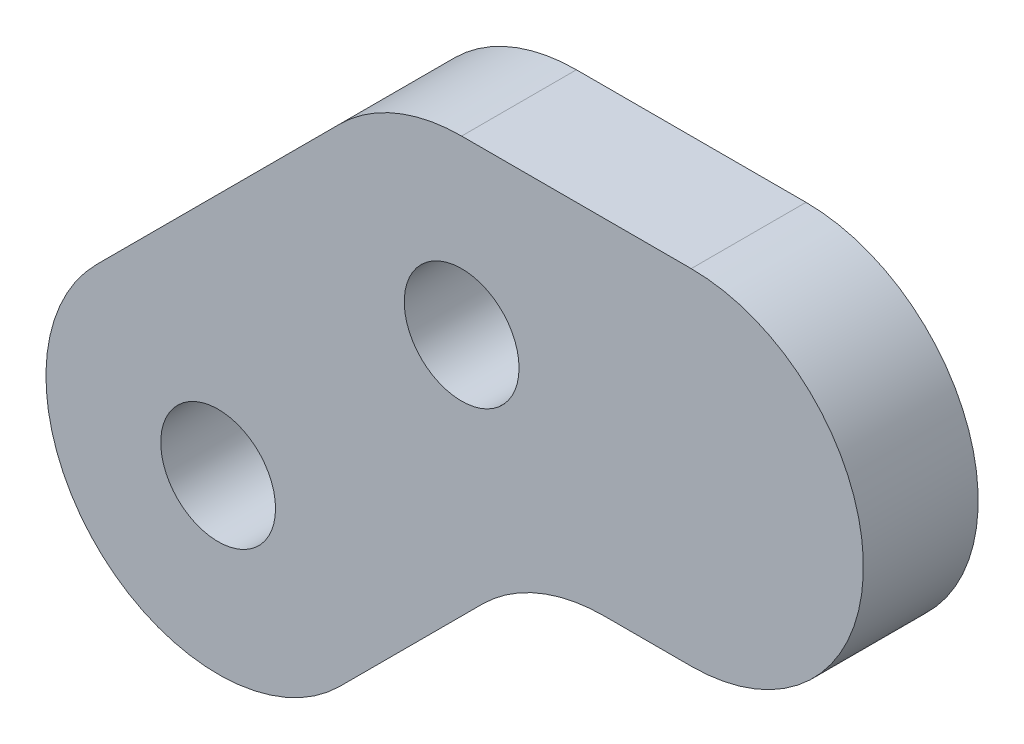
ISO-10303-21;
HEADER;
FILE_DESCRIPTION(('STEP AP214'),'2;1');
FILE_NAME('part.step','',(''),(''),'','','');
FILE_SCHEMA(('AUTOMOTIVE_DESIGN { 1 0 10303 214 1 1 1 1 }'));
ENDSEC;
DATA;
#1=APPLICATION_CONTEXT('core data for automotive mechanical design processes');
#2=APPLICATION_PROTOCOL_DEFINITION('international standard','automotive_design',2000,#1);
#3=PRODUCT_CONTEXT('',#1,'mechanical');
#4=PRODUCT('Part','Part','',(#3));
#5=PRODUCT_RELATED_PRODUCT_CATEGORY('part','',(#4));
#6=PRODUCT_DEFINITION_FORMATION('','',#4);
#7=PRODUCT_DEFINITION_CONTEXT('part definition',#1,'design');
#8=PRODUCT_DEFINITION('design','',#6,#7);
#9=PRODUCT_DEFINITION_SHAPE('','',#8);
#10=(LENGTH_UNIT() NAMED_UNIT(*) SI_UNIT(.MILLI.,.METRE.));
#11=(NAMED_UNIT(*) PLANE_ANGLE_UNIT() SI_UNIT($,.RADIAN.));
#12=(NAMED_UNIT(*) SI_UNIT($,.STERADIAN.) SOLID_ANGLE_UNIT());
#13=UNCERTAINTY_MEASURE_WITH_UNIT(LENGTH_MEASURE(1.E-05),#10,'distance_accuracy_value','');
#14=(GEOMETRIC_REPRESENTATION_CONTEXT(3) GLOBAL_UNCERTAINTY_ASSIGNED_CONTEXT((#13)) GLOBAL_UNIT_ASSIGNED_CONTEXT((#10,
#11,#12)) REPRESENTATION_CONTEXT('',''));
#15=CARTESIAN_POINT('',(0.,0.,0.));
#16=DIRECTION('',(0.,0.,1.));
#17=DIRECTION('',(1.,0.,0.));
#18=AXIS2_PLACEMENT_3D('',#15,#16,#17);
#19=CARTESIAN_POINT('',(139.5991218753,252.9956717112,3.));
#20=DIRECTION('',(0.,0.,1.));
#21=DIRECTION('',(1.,0.,0.));
#22=AXIS2_PLACEMENT_3D('',#19,#20,#21);
#23=PLANE('',#22);
#24=CARTESIAN_POINT('',(133.599121875279,252.9956717112,3.));
#25=DIRECTION('',(0.,0.,1.));
#26=DIRECTION('',(1.,0.,0.));
#27=AXIS2_PLACEMENT_3D('',#24,#25,#26);
#28=CIRCLE('',#27,1.50000000002112);
#29=CARTESIAN_POINT('',(135.0991218753,252.9956717112,3.));
#30=VERTEX_POINT('',#29);
#31=EDGE_CURVE('E135',#30,#30,#28,.T.);
#32=ORIENTED_EDGE('',*,*,#31,.F.);
#33=EDGE_LOOP('',(#32));
#34=FACE_BOUND('',#33,.T.);
#35=CARTESIAN_POINT('',(139.5991218753,252.9956717112,3.));
#36=DIRECTION('',(0.,0.,1.));
#37=DIRECTION('',(1.,0.,0.));
#38=AXIS2_PLACEMENT_3D('',#35,#36,#37);
#39=CIRCLE('',#38,4.49999999999998);
#40=CARTESIAN_POINT('',(139.5991218753,248.4956717112,3.));
#41=VERTEX_POINT('',#40);
#42=CARTESIAN_POINT('',(139.5991218753,257.4956717112,3.));
#43=VERTEX_POINT('',#42);
#44=EDGE_CURVE('E147',#41,#43,#39,.T.);
#45=ORIENTED_EDGE('',*,*,#44,.T.);
#46=DIRECTION('',(-1.,0.,0.));
#47=VECTOR('',#46,1.);
#48=CARTESIAN_POINT('',(139.5991218753,257.4956717112,3.));
#49=LINE('',#48,#47);
#50=CARTESIAN_POINT('',(133.5991218753,257.4956717112,3.));
#51=VERTEX_POINT('',#50);
#52=EDGE_CURVE('E91',#43,#51,#49,.T.);
#53=ORIENTED_EDGE('',*,*,#52,.T.);
#54=CARTESIAN_POINT('',(133.599121875279,252.9956717112,3.));
#55=DIRECTION('',(0.,0.,1.));
#56=DIRECTION('',(1.,0.,0.));
#57=AXIS2_PLACEMENT_3D('',#54,#55,#56);
#58=CIRCLE('',#57,4.5);
#59=CARTESIAN_POINT('',(130.4171413599,256.1776522265,3.));
#60=VERTEX_POINT('',#59);
#61=EDGE_CURVE('E162',#51,#60,#58,.T.);
#62=ORIENTED_EDGE('',*,*,#61,.T.);
#63=DIRECTION('',(-0.707106781186548,-0.707106781186547,0.));
#64=VECTOR('',#63,1.);
#65=CARTESIAN_POINT('',(124.0531803292,249.8136911958,3.));
#66=LINE('',#65,#64);
#67=CARTESIAN_POINT('',(124.0531803292,249.8136911958,3.));
#68=VERTEX_POINT('',#67);
#69=EDGE_CURVE('E173',#60,#68,#66,.T.);
#70=ORIENTED_EDGE('',*,*,#69,.T.);
#71=CARTESIAN_POINT('',(127.23516084455,246.6317106805,3.));
#72=DIRECTION('',(0.,0.,1.));
#73=DIRECTION('',(1.,0.,0.));
#74=AXIS2_PLACEMENT_3D('',#71,#72,#73);
#75=CIRCLE('',#74,4.49999999997955);
#76=CARTESIAN_POINT('',(130.4171413599,243.4497301652,3.));
#77=VERTEX_POINT('',#76);
#78=EDGE_CURVE('E111',#68,#77,#75,.T.);
#79=ORIENTED_EDGE('',*,*,#78,.T.);
#80=DIRECTION('',(0.707106781196034,0.707106781177061,0.));
#81=VECTOR('',#80,1.);
#82=CARTESIAN_POINT('',(130.4171413599,243.4497301652,3.));
#83=LINE('',#82,#81);
#84=CARTESIAN_POINT('',(134.1450634213,247.1776522265,3.));
#85=VERTEX_POINT('',#84);
#86=EDGE_CURVE('E104',#77,#85,#83,.T.);
#87=ORIENTED_EDGE('',*,*,#86,.T.);
#88=CARTESIAN_POINT('',(137.327043936679,243.9956717112,3.));
#89=DIRECTION('',(0.,0.,-1.));
#90=DIRECTION('',(1.,0.,0.));
#91=AXIS2_PLACEMENT_3D('',#88,#89,#90);
#92=CIRCLE('',#91,4.49999999999998);
#93=CARTESIAN_POINT('',(137.3270439366,248.4956717112,3.));
#94=VERTEX_POINT('',#93);
#95=EDGE_CURVE('E108',#85,#94,#92,.T.);
#96=ORIENTED_EDGE('',*,*,#95,.T.);
#97=DIRECTION('',(1.,0.,0.));
#98=VECTOR('',#97,1.);
#99=CARTESIAN_POINT('',(138.0991218753,248.4956717112,3.));
#100=LINE('',#99,#98);
#101=EDGE_CURVE('E50',#94,#41,#100,.T.);
#102=ORIENTED_EDGE('',*,*,#101,.T.);
#103=EDGE_LOOP('',(#45,#53,#62,#70,#79,#87,#96,#102));
#104=FACE_BOUND('',#103,.T.);
#105=CARTESIAN_POINT('',(127.23516084455,246.6317106805,3.));
#106=DIRECTION('',(0.,0.,1.));
#107=DIRECTION('',(1.,0.,0.));
#108=AXIS2_PLACEMENT_3D('',#105,#106,#107);
#109=CIRCLE('',#108,1.50000000005002);
#110=CARTESIAN_POINT('',(128.7351608446,246.6317106805,3.));
#111=VERTEX_POINT('',#110);
#112=EDGE_CURVE('E182',#111,#111,#109,.T.);
#113=ORIENTED_EDGE('',*,*,#112,.F.);
#114=EDGE_LOOP('',(#113));
#115=FACE_BOUND('',#114,.T.);
#116=ADVANCED_FACE('F33',(#34,#104,#115),#23,.T.);
#117=CARTESIAN_POINT('',(139.5991218753,252.9956717112,0.));
#118=DIRECTION('',(0.,0.,1.));
#119=DIRECTION('',(1.,0.,0.));
#120=AXIS2_PLACEMENT_3D('',#117,#118,#119);
#121=PLANE('',#120);
#122=CARTESIAN_POINT('',(133.599121875279,252.9956717112,0.));
#123=DIRECTION('',(0.,0.,1.));
#124=DIRECTION('',(1.,0.,0.));
#125=AXIS2_PLACEMENT_3D('',#122,#123,#124);
#126=CIRCLE('',#125,1.50000000002112);
#127=CARTESIAN_POINT('',(135.0991218753,252.9956717112,0.));
#128=VERTEX_POINT('',#127);
#129=EDGE_CURVE('E179',#128,#128,#126,.T.);
#130=ORIENTED_EDGE('',*,*,#129,.T.);
#131=EDGE_LOOP('',(#130));
#132=FACE_BOUND('',#131,.T.);
#133=CARTESIAN_POINT('',(139.5991218753,252.9956717112,0.));
#134=DIRECTION('',(0.,0.,1.));
#135=DIRECTION('',(1.,0.,0.));
#136=AXIS2_PLACEMENT_3D('',#133,#134,#135);
#137=CIRCLE('',#136,4.49999999999998);
#138=CARTESIAN_POINT('',(139.5991218753,248.4956717112,0.));
#139=VERTEX_POINT('',#138);
#140=CARTESIAN_POINT('',(139.5991218753,257.4956717112,0.));
#141=VERTEX_POINT('',#140);
#142=EDGE_CURVE('E131',#139,#141,#137,.T.);
#143=ORIENTED_EDGE('',*,*,#142,.F.);
#144=DIRECTION('',(1.,0.,0.));
#145=VECTOR('',#144,1.);
#146=CARTESIAN_POINT('',(138.0991218753,248.4956717112,0.));
#147=LINE('',#146,#145);
#148=CARTESIAN_POINT('',(137.3270439366,248.4956717112,0.));
#149=VERTEX_POINT('',#148);
#150=EDGE_CURVE('E79',#149,#139,#147,.T.);
#151=ORIENTED_EDGE('',*,*,#150,.F.);
#152=CARTESIAN_POINT('',(137.327043936679,243.9956717112,0.));
#153=DIRECTION('',(0.,0.,-1.));
#154=DIRECTION('',(1.,0.,0.));
#155=AXIS2_PLACEMENT_3D('',#152,#153,#154);
#156=CIRCLE('',#155,4.49999999999998);
#157=CARTESIAN_POINT('',(134.1450634213,247.1776522265,0.));
#158=VERTEX_POINT('',#157);
#159=EDGE_CURVE('E144',#158,#149,#156,.T.);
#160=ORIENTED_EDGE('',*,*,#159,.F.);
#161=DIRECTION('',(0.707106781196034,0.707106781177061,0.));
#162=VECTOR('',#161,1.);
#163=CARTESIAN_POINT('',(130.4171413599,243.4497301652,0.));
#164=LINE('',#163,#162);
#165=CARTESIAN_POINT('',(130.4171413599,243.4497301652,0.));
#166=VERTEX_POINT('',#165);
#167=EDGE_CURVE('E120',#166,#158,#164,.T.);
#168=ORIENTED_EDGE('',*,*,#167,.F.);
#169=CARTESIAN_POINT('',(127.23516084455,246.6317106805,0.));
#170=DIRECTION('',(0.,0.,1.));
#171=DIRECTION('',(1.,0.,0.));
#172=AXIS2_PLACEMENT_3D('',#169,#170,#171);
#173=CIRCLE('',#172,4.49999999997955);
#174=CARTESIAN_POINT('',(124.0531803292,249.8136911958,0.));
#175=VERTEX_POINT('',#174);
#176=EDGE_CURVE('E141',#175,#166,#173,.T.);
#177=ORIENTED_EDGE('',*,*,#176,.F.);
#178=DIRECTION('',(-0.707106781186548,-0.707106781186547,0.));
#179=VECTOR('',#178,1.);
#180=CARTESIAN_POINT('',(124.0531803292,249.8136911958,0.));
#181=LINE('',#180,#179);
#182=CARTESIAN_POINT('',(130.4171413599,256.1776522265,0.));
#183=VERTEX_POINT('',#182);
#184=EDGE_CURVE('E139',#183,#175,#181,.T.);
#185=ORIENTED_EDGE('',*,*,#184,.F.);
#186=CARTESIAN_POINT('',(133.599121875279,252.9956717112,0.));
#187=DIRECTION('',(0.,0.,1.));
#188=DIRECTION('',(1.,0.,0.));
#189=AXIS2_PLACEMENT_3D('',#186,#187,#188);
#190=CIRCLE('',#189,4.5);
#191=CARTESIAN_POINT('',(133.5991218753,257.4956717112,0.));
#192=VERTEX_POINT('',#191);
#193=EDGE_CURVE('E137',#192,#183,#190,.T.);
#194=ORIENTED_EDGE('',*,*,#193,.F.);
#195=DIRECTION('',(-1.,0.,0.));
#196=VECTOR('',#195,1.);
#197=CARTESIAN_POINT('',(139.5991218753,257.4956717112,0.));
#198=LINE('',#197,#196);
#199=EDGE_CURVE('E134',#141,#192,#198,.T.);
#200=ORIENTED_EDGE('',*,*,#199,.F.);
#201=EDGE_LOOP('',(#143,#151,#160,#168,#177,#185,#194,#200));
#202=FACE_BOUND('',#201,.T.);
#203=CARTESIAN_POINT('',(127.23516084455,246.6317106805,0.));
#204=DIRECTION('',(0.,0.,1.));
#205=DIRECTION('',(1.,0.,0.));
#206=AXIS2_PLACEMENT_3D('',#203,#204,#205);
#207=CIRCLE('',#206,1.50000000005002);
#208=CARTESIAN_POINT('',(128.7351608446,246.6317106805,0.));
#209=VERTEX_POINT('',#208);
#210=EDGE_CURVE('E185',#209,#209,#207,.T.);
#211=ORIENTED_EDGE('',*,*,#210,.T.);
#212=EDGE_LOOP('',(#211));
#213=FACE_BOUND('',#212,.T.);
#214=ADVANCED_FACE('F164',(#132,#202,#213),#121,.F.);
#215=CARTESIAN_POINT('',(139.5991218753,252.9956717112,3.));
#216=DIRECTION('',(0.,0.,-1.));
#217=DIRECTION('',(-1.,0.,0.));
#218=AXIS2_PLACEMENT_3D('',#215,#216,#217);
#219=CYLINDRICAL_SURFACE('',#218,4.49999999999998);
#220=ORIENTED_EDGE('',*,*,#142,.T.);
#221=DIRECTION('',(0.,0.,-1.));
#222=VECTOR('',#221,1.);
#223=CARTESIAN_POINT('',(139.5991218753,257.4956717112,3.));
#224=LINE('',#223,#222);
#225=EDGE_CURVE('E11',#43,#141,#224,.T.);
#226=ORIENTED_EDGE('',*,*,#225,.F.);
#227=ORIENTED_EDGE('',*,*,#44,.F.);
#228=DIRECTION('',(0.,0.,-1.));
#229=VECTOR('',#228,1.);
#230=CARTESIAN_POINT('',(139.5991218753,248.4956717112,3.));
#231=LINE('',#230,#229);
#232=EDGE_CURVE('E127',#41,#139,#231,.T.);
#233=ORIENTED_EDGE('',*,*,#232,.T.);
#234=EDGE_LOOP('',(#220,#226,#227,#233));
#235=FACE_BOUND('',#234,.T.);
#236=ADVANCED_FACE('F35',(#235),#219,.T.);
#237=CARTESIAN_POINT('',(139.5991218753,257.4956717112,3.));
#238=DIRECTION('',(0.,-1.,0.));
#239=DIRECTION('',(0.,0.,-1.));
#240=AXIS2_PLACEMENT_3D('',#237,#238,#239);
#241=PLANE('',#240);
#242=ORIENTED_EDGE('',*,*,#199,.T.);
#243=DIRECTION('',(0.,0.,-1.));
#244=VECTOR('',#243,1.);
#245=CARTESIAN_POINT('',(133.5991218753,257.4956717112,3.));
#246=LINE('',#245,#244);
#247=EDGE_CURVE('E42',#51,#192,#246,.T.);
#248=ORIENTED_EDGE('',*,*,#247,.F.);
#249=ORIENTED_EDGE('',*,*,#52,.F.);
#250=ORIENTED_EDGE('',*,*,#225,.T.);
#251=EDGE_LOOP('',(#242,#248,#249,#250));
#252=FACE_BOUND('',#251,.T.);
#253=ADVANCED_FACE('F218',(#252),#241,.F.);
#254=CARTESIAN_POINT('',(133.599121875279,252.9956717112,3.));
#255=DIRECTION('',(0.,0.,-1.));
#256=DIRECTION('',(-1.,0.,0.));
#257=AXIS2_PLACEMENT_3D('',#254,#255,#256);
#258=CYLINDRICAL_SURFACE('',#257,4.5);
#259=ORIENTED_EDGE('',*,*,#193,.T.);
#260=DIRECTION('',(0.,0.,-1.));
#261=VECTOR('',#260,1.);
#262=CARTESIAN_POINT('',(130.4171413599,256.1776522265,3.));
#263=LINE('',#262,#261);
#264=EDGE_CURVE('E154',#60,#183,#263,.T.);
#265=ORIENTED_EDGE('',*,*,#264,.F.);
#266=ORIENTED_EDGE('',*,*,#61,.F.);
#267=ORIENTED_EDGE('',*,*,#247,.T.);
#268=EDGE_LOOP('',(#259,#265,#266,#267));
#269=FACE_BOUND('',#268,.T.);
#270=ADVANCED_FACE('F160',(#269),#258,.T.);
#271=CARTESIAN_POINT('',(124.0531803292,249.8136911958,3.));
#272=DIRECTION('',(0.707106781186547,-0.707106781186548,0.));
#273=DIRECTION('',(0.707106781186548,0.707106781186547,0.));
#274=AXIS2_PLACEMENT_3D('',#271,#272,#273);
#275=PLANE('',#274);
#276=ORIENTED_EDGE('',*,*,#184,.T.);
#277=DIRECTION('',(0.,0.,-1.));
#278=VECTOR('',#277,1.);
#279=CARTESIAN_POINT('',(124.0531803292,249.8136911958,3.));
#280=LINE('',#279,#278);
#281=EDGE_CURVE('E151',#68,#175,#280,.T.);
#282=ORIENTED_EDGE('',*,*,#281,.F.);
#283=ORIENTED_EDGE('',*,*,#69,.F.);
#284=ORIENTED_EDGE('',*,*,#264,.T.);
#285=EDGE_LOOP('',(#276,#282,#283,#284));
#286=FACE_BOUND('',#285,.T.);
#287=ADVANCED_FACE('F169',(#286),#275,.F.);
#288=CARTESIAN_POINT('',(127.23516084455,246.6317106805,3.));
#289=DIRECTION('',(0.,0.,-1.));
#290=DIRECTION('',(-1.,0.,0.));
#291=AXIS2_PLACEMENT_3D('',#288,#289,#290);
#292=CYLINDRICAL_SURFACE('',#291,4.49999999997955);
#293=ORIENTED_EDGE('',*,*,#176,.T.);
#294=DIRECTION('',(0.,0.,-1.));
#295=VECTOR('',#294,1.);
#296=CARTESIAN_POINT('',(130.4171413599,243.4497301652,3.));
#297=LINE('',#296,#295);
#298=EDGE_CURVE('E122',#77,#166,#297,.T.);
#299=ORIENTED_EDGE('',*,*,#298,.F.);
#300=ORIENTED_EDGE('',*,*,#78,.F.);
#301=ORIENTED_EDGE('',*,*,#281,.T.);
#302=EDGE_LOOP('',(#293,#299,#300,#301));
#303=FACE_BOUND('',#302,.T.);
#304=ADVANCED_FACE('F172',(#303),#292,.T.);
#305=CARTESIAN_POINT('',(130.4171413599,243.4497301652,3.));
#306=DIRECTION('',(-0.707106781177061,0.707106781196034,0.));
#307=DIRECTION('',(-0.707106781196034,-0.707106781177061,0.));
#308=AXIS2_PLACEMENT_3D('',#305,#306,#307);
#309=PLANE('',#308);
#310=ORIENTED_EDGE('',*,*,#167,.T.);
#311=DIRECTION('',(0.,0.,-1.));
#312=VECTOR('',#311,1.);
#313=CARTESIAN_POINT('',(134.1450634213,247.1776522265,3.));
#314=LINE('',#313,#312);
#315=EDGE_CURVE('E117',#85,#158,#314,.T.);
#316=ORIENTED_EDGE('',*,*,#315,.F.);
#317=ORIENTED_EDGE('',*,*,#86,.F.);
#318=ORIENTED_EDGE('',*,*,#298,.T.);
#319=EDGE_LOOP('',(#310,#316,#317,#318));
#320=FACE_BOUND('',#319,.T.);
#321=ADVANCED_FACE('F118',(#320),#309,.F.);
#322=CARTESIAN_POINT('',(137.327043936679,243.9956717112,3.));
#323=DIRECTION('',(0.,0.,-1.));
#324=DIRECTION('',(-1.,0.,0.));
#325=AXIS2_PLACEMENT_3D('',#322,#323,#324);
#326=CYLINDRICAL_SURFACE('',#325,4.49999999999998);
#327=ORIENTED_EDGE('',*,*,#159,.T.);
#328=DIRECTION('',(0.,0.,-1.));
#329=VECTOR('',#328,1.);
#330=CARTESIAN_POINT('',(137.3270439366,248.4956717112,3.));
#331=LINE('',#330,#329);
#332=EDGE_CURVE('E123',#94,#149,#331,.T.);
#333=ORIENTED_EDGE('',*,*,#332,.F.);
#334=ORIENTED_EDGE('',*,*,#95,.F.);
#335=ORIENTED_EDGE('',*,*,#315,.T.);
#336=EDGE_LOOP('',(#327,#333,#334,#335));
#337=FACE_BOUND('',#336,.T.);
#338=ADVANCED_FACE('F125',(#337),#326,.F.);
#339=CARTESIAN_POINT('',(138.0991218753,248.4956717112,3.));
#340=DIRECTION('',(0.,1.,0.));
#341=DIRECTION('',(0.,0.,1.));
#342=AXIS2_PLACEMENT_3D('',#339,#340,#341);
#343=PLANE('',#342);
#344=ORIENTED_EDGE('',*,*,#150,.T.);
#345=ORIENTED_EDGE('',*,*,#232,.F.);
#346=ORIENTED_EDGE('',*,*,#101,.F.);
#347=ORIENTED_EDGE('',*,*,#332,.T.);
#348=EDGE_LOOP('',(#344,#345,#346,#347));
#349=FACE_BOUND('',#348,.T.);
#350=ADVANCED_FACE('F206',(#349),#343,.F.);
#351=CARTESIAN_POINT('',(133.599121875279,252.9956717112,3.));
#352=DIRECTION('',(0.,0.,-1.));
#353=DIRECTION('',(-1.,0.,0.));
#354=AXIS2_PLACEMENT_3D('',#351,#352,#353);
#355=CYLINDRICAL_SURFACE('',#354,1.50000000002112);
#356=ORIENTED_EDGE('',*,*,#31,.T.);
#357=EDGE_LOOP('',(#356));
#358=FACE_BOUND('',#357,.T.);
#359=ORIENTED_EDGE('',*,*,#129,.F.);
#360=EDGE_LOOP('',(#359));
#361=FACE_BOUND('',#360,.T.);
#362=ADVANCED_FACE('F203',(#358,#361),#355,.F.);
#363=CARTESIAN_POINT('',(127.23516084455,246.6317106805,3.));
#364=DIRECTION('',(0.,0.,-1.));
#365=DIRECTION('',(-1.,0.,0.));
#366=AXIS2_PLACEMENT_3D('',#363,#364,#365);
#367=CYLINDRICAL_SURFACE('',#366,1.50000000005002);
#368=ORIENTED_EDGE('',*,*,#112,.T.);
#369=EDGE_LOOP('',(#368));
#370=FACE_BOUND('',#369,.T.);
#371=ORIENTED_EDGE('',*,*,#210,.F.);
#372=EDGE_LOOP('',(#371));
#373=FACE_BOUND('',#372,.T.);
#374=ADVANCED_FACE('F191',(#370,#373),#367,.F.);
#375=CLOSED_SHELL('',(#116,#214,#236,#253,#270,#287,#304,#321,#338,#350,#362,#374));
#376=MANIFOLD_SOLID_BREP('B2',#375);
#377=ADVANCED_BREP_SHAPE_REPRESENTATION('',(#18,#376),#14);
#378=SHAPE_DEFINITION_REPRESENTATION(#9,#377);
ENDSEC;
END-ISO-10303-21;
